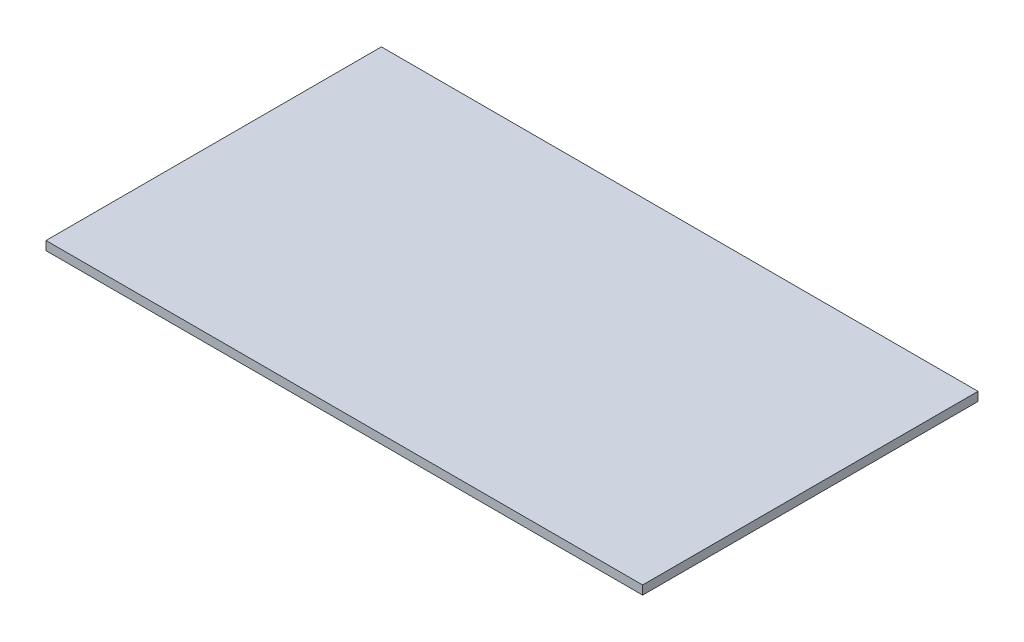
ISO-10303-21;
HEADER;
FILE_DESCRIPTION(('STEP AP214'),'2;1');
FILE_NAME('part.step','',(''),(''),'','','');
FILE_SCHEMA(('AUTOMOTIVE_DESIGN { 1 0 10303 214 1 1 1 1 }'));
ENDSEC;
DATA;
#1=APPLICATION_CONTEXT('core data for automotive mechanical design processes');
#2=APPLICATION_PROTOCOL_DEFINITION('international standard','automotive_design',2000,#1);
#3=PRODUCT_CONTEXT('',#1,'mechanical');
#4=PRODUCT('Part','Part','',(#3));
#5=PRODUCT_RELATED_PRODUCT_CATEGORY('part','',(#4));
#6=PRODUCT_DEFINITION_FORMATION('','',#4);
#7=PRODUCT_DEFINITION_CONTEXT('part definition',#1,'design');
#8=PRODUCT_DEFINITION('design','',#6,#7);
#9=PRODUCT_DEFINITION_SHAPE('','',#8);
#10=(LENGTH_UNIT() NAMED_UNIT(*) SI_UNIT(.MILLI.,.METRE.));
#11=(NAMED_UNIT(*) PLANE_ANGLE_UNIT() SI_UNIT($,.RADIAN.));
#12=(NAMED_UNIT(*) SI_UNIT($,.STERADIAN.) SOLID_ANGLE_UNIT());
#13=UNCERTAINTY_MEASURE_WITH_UNIT(LENGTH_MEASURE(1.E-05),#10,'distance_accuracy_value','');
#14=(GEOMETRIC_REPRESENTATION_CONTEXT(3) GLOBAL_UNCERTAINTY_ASSIGNED_CONTEXT((#13)) GLOBAL_UNIT_ASSIGNED_CONTEXT((#10,
#11,#12)) REPRESENTATION_CONTEXT('',''));
#15=CARTESIAN_POINT('',(0.,0.,0.));
#16=DIRECTION('',(0.,0.,1.));
#17=DIRECTION('',(1.,0.,0.));
#18=AXIS2_PLACEMENT_3D('',#15,#16,#17);
#19=CARTESIAN_POINT('',(0.,5.,0.));
#20=DIRECTION('',(1.,0.,0.));
#21=DIRECTION('',(0.,0.,-1.));
#22=AXIS2_PLACEMENT_3D('',#19,#20,#21);
#23=PLANE('',#22);
#24=DIRECTION('',(0.,0.,1.));
#25=VECTOR('',#24,1.);
#26=CARTESIAN_POINT('',(0.,0.,0.));
#27=LINE('',#26,#25);
#28=CARTESIAN_POINT('',(0.,0.,-190.));
#29=VERTEX_POINT('',#28);
#30=CARTESIAN_POINT('',(0.,0.,0.));
#31=VERTEX_POINT('',#30);
#32=EDGE_CURVE('E98',#29,#31,#27,.T.);
#33=ORIENTED_EDGE('',*,*,#32,.T.);
#34=DIRECTION('',(0.,-1.,0.));
#35=VECTOR('',#34,1.);
#36=CARTESIAN_POINT('',(0.,5.,0.));
#37=LINE('',#36,#35);
#38=CARTESIAN_POINT('',(0.,5.,0.));
#39=VERTEX_POINT('',#38);
#40=EDGE_CURVE('E11',#39,#31,#37,.T.);
#41=ORIENTED_EDGE('',*,*,#40,.F.);
#42=DIRECTION('',(0.,0.,1.));
#43=VECTOR('',#42,1.);
#44=CARTESIAN_POINT('',(0.,5.,0.));
#45=LINE('',#44,#43);
#46=CARTESIAN_POINT('',(0.,5.,-190.));
#47=VERTEX_POINT('',#46);
#48=EDGE_CURVE('E86',#47,#39,#45,.T.);
#49=ORIENTED_EDGE('',*,*,#48,.F.);
#50=DIRECTION('',(0.,-1.,0.));
#51=VECTOR('',#50,1.);
#52=CARTESIAN_POINT('',(0.,5.,-190.));
#53=LINE('',#52,#51);
#54=EDGE_CURVE('E94',#47,#29,#53,.T.);
#55=ORIENTED_EDGE('',*,*,#54,.T.);
#56=EDGE_LOOP('',(#33,#41,#49,#55));
#57=FACE_BOUND('',#56,.T.);
#58=ADVANCED_FACE('F35',(#57),#23,.F.);
#59=CARTESIAN_POINT('',(0.,5.,0.));
#60=DIRECTION('',(0.,0.,-1.));
#61=DIRECTION('',(-1.,0.,0.));
#62=AXIS2_PLACEMENT_3D('',#59,#60,#61);
#63=PLANE('',#62);
#64=DIRECTION('',(1.,0.,0.));
#65=VECTOR('',#64,1.);
#66=CARTESIAN_POINT('',(0.,0.,0.));
#67=LINE('',#66,#65);
#68=CARTESIAN_POINT('',(338.,0.,0.));
#69=VERTEX_POINT('',#68);
#70=EDGE_CURVE('E90',#31,#69,#67,.T.);
#71=ORIENTED_EDGE('',*,*,#70,.T.);
#72=DIRECTION('',(0.,-1.,0.));
#73=VECTOR('',#72,1.);
#74=CARTESIAN_POINT('',(338.,5.,0.));
#75=LINE('',#74,#73);
#76=CARTESIAN_POINT('',(338.,5.,0.));
#77=VERTEX_POINT('',#76);
#78=EDGE_CURVE('E43',#77,#69,#75,.T.);
#79=ORIENTED_EDGE('',*,*,#78,.F.);
#80=DIRECTION('',(1.,0.,0.));
#81=VECTOR('',#80,1.);
#82=CARTESIAN_POINT('',(0.,5.,0.));
#83=LINE('',#82,#81);
#84=EDGE_CURVE('E81',#39,#77,#83,.T.);
#85=ORIENTED_EDGE('',*,*,#84,.F.);
#86=ORIENTED_EDGE('',*,*,#40,.T.);
#87=EDGE_LOOP('',(#71,#79,#85,#86));
#88=FACE_BOUND('',#87,.T.);
#89=ADVANCED_FACE('F89',(#88),#63,.F.);
#90=CARTESIAN_POINT('',(338.,5.,0.));
#91=DIRECTION('',(-1.,0.,0.));
#92=DIRECTION('',(0.,0.,1.));
#93=AXIS2_PLACEMENT_3D('',#90,#91,#92);
#94=PLANE('',#93);
#95=DIRECTION('',(0.,0.,-1.));
#96=VECTOR('',#95,1.);
#97=CARTESIAN_POINT('',(338.,0.,0.));
#98=LINE('',#97,#96);
#99=CARTESIAN_POINT('',(338.,0.,-190.));
#100=VERTEX_POINT('',#99);
#101=EDGE_CURVE('E68',#69,#100,#98,.T.);
#102=ORIENTED_EDGE('',*,*,#101,.T.);
#103=DIRECTION('',(0.,-1.,0.));
#104=VECTOR('',#103,1.);
#105=CARTESIAN_POINT('',(338.,5.,-190.));
#106=LINE('',#105,#104);
#107=CARTESIAN_POINT('',(338.,5.,-190.));
#108=VERTEX_POINT('',#107);
#109=EDGE_CURVE('E91',#108,#100,#106,.T.);
#110=ORIENTED_EDGE('',*,*,#109,.F.);
#111=DIRECTION('',(0.,0.,-1.));
#112=VECTOR('',#111,1.);
#113=CARTESIAN_POINT('',(338.,5.,0.));
#114=LINE('',#113,#112);
#115=EDGE_CURVE('E84',#77,#108,#114,.T.);
#116=ORIENTED_EDGE('',*,*,#115,.F.);
#117=ORIENTED_EDGE('',*,*,#78,.T.);
#118=EDGE_LOOP('',(#102,#110,#116,#117));
#119=FACE_BOUND('',#118,.T.);
#120=ADVANCED_FACE('F92',(#119),#94,.F.);
#121=CARTESIAN_POINT('',(0.,5.,-190.));
#122=DIRECTION('',(0.,0.,1.));
#123=DIRECTION('',(1.,0.,0.));
#124=AXIS2_PLACEMENT_3D('',#121,#122,#123);
#125=PLANE('',#124);
#126=DIRECTION('',(-1.,0.,0.));
#127=VECTOR('',#126,1.);
#128=CARTESIAN_POINT('',(0.,0.,-190.));
#129=LINE('',#128,#127);
#130=EDGE_CURVE('E74',#100,#29,#129,.T.);
#131=ORIENTED_EDGE('',*,*,#130,.T.);
#132=ORIENTED_EDGE('',*,*,#54,.F.);
#133=DIRECTION('',(-1.,0.,0.));
#134=VECTOR('',#133,1.);
#135=CARTESIAN_POINT('',(0.,5.,-190.));
#136=LINE('',#135,#134);
#137=EDGE_CURVE('E51',#108,#47,#136,.T.);
#138=ORIENTED_EDGE('',*,*,#137,.F.);
#139=ORIENTED_EDGE('',*,*,#109,.T.);
#140=EDGE_LOOP('',(#131,#132,#138,#139));
#141=FACE_BOUND('',#140,.T.);
#142=ADVANCED_FACE('F105',(#141),#125,.F.);
#143=CARTESIAN_POINT('',(0.,5.,0.));
#144=DIRECTION('',(0.,-1.,0.));
#145=DIRECTION('',(0.,0.,-1.));
#146=AXIS2_PLACEMENT_3D('',#143,#144,#145);
#147=PLANE('',#146);
#148=ORIENTED_EDGE('',*,*,#48,.T.);
#149=ORIENTED_EDGE('',*,*,#84,.T.);
#150=ORIENTED_EDGE('',*,*,#115,.T.);
#151=ORIENTED_EDGE('',*,*,#137,.T.);
#152=EDGE_LOOP('',(#148,#149,#150,#151));
#153=FACE_BOUND('',#152,.T.);
#154=ADVANCED_FACE('F82',(#153),#147,.F.);
#155=CARTESIAN_POINT('',(0.,0.,0.));
#156=DIRECTION('',(0.,-1.,0.));
#157=DIRECTION('',(0.,0.,-1.));
#158=AXIS2_PLACEMENT_3D('',#155,#156,#157);
#159=PLANE('',#158);
#160=ORIENTED_EDGE('',*,*,#32,.F.);
#161=ORIENTED_EDGE('',*,*,#130,.F.);
#162=ORIENTED_EDGE('',*,*,#101,.F.);
#163=ORIENTED_EDGE('',*,*,#70,.F.);
#164=EDGE_LOOP('',(#160,#161,#162,#163));
#165=FACE_BOUND('',#164,.T.);
#166=ADVANCED_FACE('F108',(#165),#159,.T.);
#167=CLOSED_SHELL('',(#58,#89,#120,#142,#154,#166));
#168=MANIFOLD_SOLID_BREP('B2',#167);
#169=ADVANCED_BREP_SHAPE_REPRESENTATION('',(#18,#168),#14);
#170=SHAPE_DEFINITION_REPRESENTATION(#9,#169);
ENDSEC;
END-ISO-10303-21;
